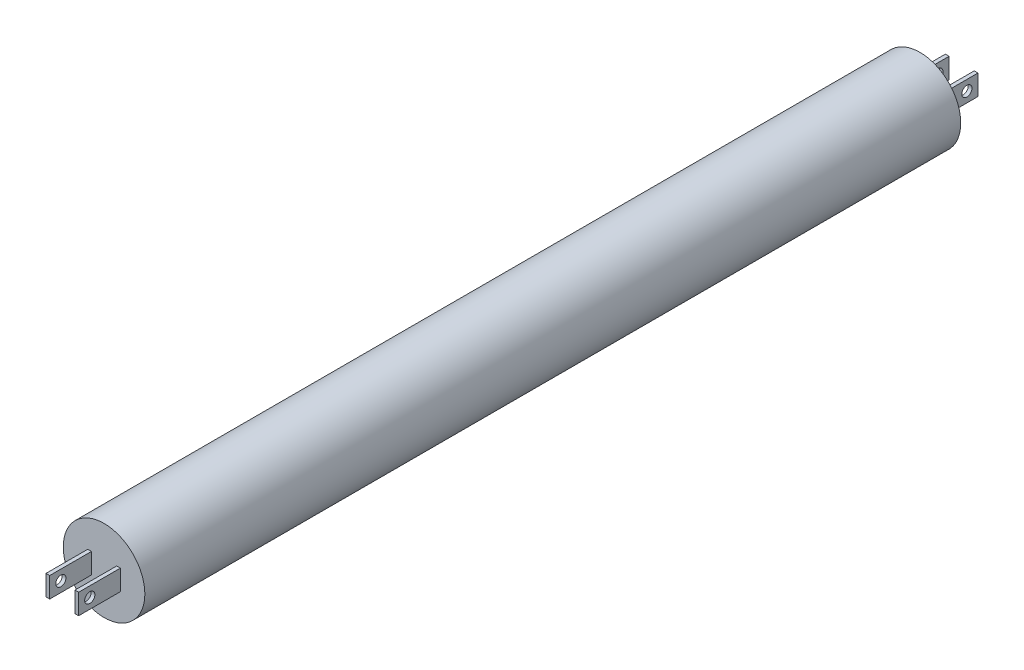
ISO-10303-21;
HEADER;
FILE_DESCRIPTION(('STEP AP214'),'2;1');
FILE_NAME('part.step','',(''),(''),'','','');
FILE_SCHEMA(('AUTOMOTIVE_DESIGN { 1 0 10303 214 1 1 1 1 }'));
ENDSEC;
DATA;
#1=APPLICATION_CONTEXT('core data for automotive mechanical design processes');
#2=APPLICATION_PROTOCOL_DEFINITION('international standard','automotive_design',2000,#1);
#3=PRODUCT_CONTEXT('',#1,'mechanical');
#4=PRODUCT('Part','Part','',(#3));
#5=PRODUCT_RELATED_PRODUCT_CATEGORY('part','',(#4));
#6=PRODUCT_DEFINITION_FORMATION('','',#4);
#7=PRODUCT_DEFINITION_CONTEXT('part definition',#1,'design');
#8=PRODUCT_DEFINITION('design','',#6,#7);
#9=PRODUCT_DEFINITION_SHAPE('','',#8);
#10=(LENGTH_UNIT() NAMED_UNIT(*) SI_UNIT(.MILLI.,.METRE.));
#11=(NAMED_UNIT(*) PLANE_ANGLE_UNIT() SI_UNIT($,.RADIAN.));
#12=(NAMED_UNIT(*) SI_UNIT($,.STERADIAN.) SOLID_ANGLE_UNIT());
#13=UNCERTAINTY_MEASURE_WITH_UNIT(LENGTH_MEASURE(1.E-05),#10,'distance_accuracy_value','');
#14=(GEOMETRIC_REPRESENTATION_CONTEXT(3) GLOBAL_UNCERTAINTY_ASSIGNED_CONTEXT((#13)) GLOBAL_UNIT_ASSIGNED_CONTEXT((#10,
#11,#12)) REPRESENTATION_CONTEXT('',''));
#15=CARTESIAN_POINT('',(0.,0.,0.));
#16=DIRECTION('',(0.,0.,1.));
#17=DIRECTION('',(1.,0.,0.));
#18=AXIS2_PLACEMENT_3D('',#15,#16,#17);
#19=CARTESIAN_POINT('',(0.,0.,200.));
#20=DIRECTION('',(0.,0.,-1.));
#21=DIRECTION('',(-1.,0.,0.));
#22=AXIS2_PLACEMENT_3D('',#19,#20,#21);
#23=CYLINDRICAL_SURFACE('',#22,20.);
#24=CARTESIAN_POINT('',(0.,0.,200.));
#25=DIRECTION('',(0.,0.,1.));
#26=DIRECTION('',(1.,0.,0.));
#27=AXIS2_PLACEMENT_3D('',#24,#25,#26);
#28=CIRCLE('',#27,20.);
#29=CARTESIAN_POINT('',(20.,0.,200.));
#30=VERTEX_POINT('',#29);
#31=EDGE_CURVE('E11',#30,#30,#28,.T.);
#32=ORIENTED_EDGE('',*,*,#31,.F.);
#33=EDGE_LOOP('',(#32));
#34=FACE_BOUND('',#33,.T.);
#35=CARTESIAN_POINT('',(0.,0.,-200.));
#36=DIRECTION('',(0.,0.,1.));
#37=DIRECTION('',(1.,0.,0.));
#38=AXIS2_PLACEMENT_3D('',#35,#36,#37);
#39=CIRCLE('',#38,20.);
#40=CARTESIAN_POINT('',(20.,0.,-200.));
#41=VERTEX_POINT('',#40);
#42=EDGE_CURVE('E43',#41,#41,#39,.T.);
#43=ORIENTED_EDGE('',*,*,#42,.T.);
#44=EDGE_LOOP('',(#43));
#45=FACE_BOUND('',#44,.T.);
#46=ADVANCED_FACE('F35',(#34,#45),#23,.T.);
#47=CARTESIAN_POINT('',(0.,0.,200.));
#48=DIRECTION('',(0.,0.,1.));
#49=DIRECTION('',(1.,0.,0.));
#50=AXIS2_PLACEMENT_3D('',#47,#48,#49);
#51=PLANE('',#50);
#52=DIRECTION('',(-1.,0.,0.));
#53=VECTOR('',#52,1.);
#54=CARTESIAN_POINT('',(0.,5.,200.));
#55=LINE('',#54,#53);
#56=CARTESIAN_POINT('',(-6.18051130788882,5.,200.));
#57=VERTEX_POINT('',#56);
#58=CARTESIAN_POINT('',(-8.,5.,200.));
#59=VERTEX_POINT('',#58);
#60=EDGE_CURVE('E218',#57,#59,#55,.T.);
#61=ORIENTED_EDGE('',*,*,#60,.F.);
#62=DIRECTION('',(0.,-1.,0.));
#63=VECTOR('',#62,1.);
#64=CARTESIAN_POINT('',(-6.18051130788882,5.,200.));
#65=LINE('',#64,#63);
#66=CARTESIAN_POINT('',(-6.18051130788882,-5.,200.));
#67=VERTEX_POINT('',#66);
#68=EDGE_CURVE('E230',#57,#67,#65,.T.);
#69=ORIENTED_EDGE('',*,*,#68,.T.);
#70=DIRECTION('',(-1.,0.,0.));
#71=VECTOR('',#70,1.);
#72=CARTESIAN_POINT('',(0.,-5.,200.));
#73=LINE('',#72,#71);
#74=CARTESIAN_POINT('',(-8.,-5.,200.));
#75=VERTEX_POINT('',#74);
#76=EDGE_CURVE('E217',#67,#75,#73,.T.);
#77=ORIENTED_EDGE('',*,*,#76,.T.);
#78=DIRECTION('',(0.,-1.,0.));
#79=VECTOR('',#78,1.);
#80=CARTESIAN_POINT('',(-8.,5.,200.));
#81=LINE('',#80,#79);
#82=EDGE_CURVE('E247',#59,#75,#81,.T.);
#83=ORIENTED_EDGE('',*,*,#82,.F.);
#84=EDGE_LOOP('',(#61,#69,#77,#83));
#85=FACE_BOUND('',#84,.T.);
#86=DIRECTION('',(1.,0.,0.));
#87=VECTOR('',#86,1.);
#88=CARTESIAN_POINT('',(0.,5.,200.));
#89=LINE('',#88,#87);
#90=CARTESIAN_POINT('',(6.18051130788882,5.,200.));
#91=VERTEX_POINT('',#90);
#92=CARTESIAN_POINT('',(8.,5.,200.));
#93=VERTEX_POINT('',#92);
#94=EDGE_CURVE('E250',#91,#93,#89,.T.);
#95=ORIENTED_EDGE('',*,*,#94,.T.);
#96=DIRECTION('',(0.,-1.,0.));
#97=VECTOR('',#96,1.);
#98=CARTESIAN_POINT('',(8.,5.,200.));
#99=LINE('',#98,#97);
#100=CARTESIAN_POINT('',(8.,-5.,200.));
#101=VERTEX_POINT('',#100);
#102=EDGE_CURVE('E261',#93,#101,#99,.T.);
#103=ORIENTED_EDGE('',*,*,#102,.T.);
#104=DIRECTION('',(1.,0.,0.));
#105=VECTOR('',#104,1.);
#106=CARTESIAN_POINT('',(0.,-5.,200.));
#107=LINE('',#106,#105);
#108=CARTESIAN_POINT('',(6.18051130788881,-5.,200.));
#109=VERTEX_POINT('',#108);
#110=EDGE_CURVE('E249',#109,#101,#107,.T.);
#111=ORIENTED_EDGE('',*,*,#110,.F.);
#112=DIRECTION('',(0.,-1.,0.));
#113=VECTOR('',#112,1.);
#114=CARTESIAN_POINT('',(6.18051130788882,5.,200.));
#115=LINE('',#114,#113);
#116=EDGE_CURVE('E277',#91,#109,#115,.T.);
#117=ORIENTED_EDGE('',*,*,#116,.F.);
#118=EDGE_LOOP('',(#95,#103,#111,#117));
#119=FACE_BOUND('',#118,.T.);
#120=ORIENTED_EDGE('',*,*,#31,.T.);
#121=EDGE_LOOP('',(#120));
#122=FACE_BOUND('',#121,.T.);
#123=ADVANCED_FACE('F321',(#85,#119,#122),#51,.T.);
#124=CARTESIAN_POINT('',(0.,0.,-200.));
#125=DIRECTION('',(0.,0.,1.));
#126=DIRECTION('',(1.,0.,0.));
#127=AXIS2_PLACEMENT_3D('',#124,#125,#126);
#128=PLANE('',#127);
#129=DIRECTION('',(0.,-1.,0.));
#130=VECTOR('',#129,1.);
#131=CARTESIAN_POINT('',(-6.18051130788881,5.,-200.));
#132=LINE('',#131,#130);
#133=CARTESIAN_POINT('',(-6.18051130788881,5.,-200.));
#134=VERTEX_POINT('',#133);
#135=CARTESIAN_POINT('',(-6.18051130788881,-5.,-200.));
#136=VERTEX_POINT('',#135);
#137=EDGE_CURVE('E51',#134,#136,#132,.T.);
#138=ORIENTED_EDGE('',*,*,#137,.F.);
#139=DIRECTION('',(-1.,0.,0.));
#140=VECTOR('',#139,1.);
#141=CARTESIAN_POINT('',(0.,5.,-200.));
#142=LINE('',#141,#140);
#143=CARTESIAN_POINT('',(-7.99999999999999,5.,-200.));
#144=VERTEX_POINT('',#143);
#145=EDGE_CURVE('E56',#134,#144,#142,.T.);
#146=ORIENTED_EDGE('',*,*,#145,.T.);
#147=DIRECTION('',(0.,-1.,0.));
#148=VECTOR('',#147,1.);
#149=CARTESIAN_POINT('',(-7.99999999999999,5.,-200.));
#150=LINE('',#149,#148);
#151=CARTESIAN_POINT('',(-7.99999999999999,-5.,-200.));
#152=VERTEX_POINT('',#151);
#153=EDGE_CURVE('E169',#144,#152,#150,.T.);
#154=ORIENTED_EDGE('',*,*,#153,.T.);
#155=DIRECTION('',(-1.,0.,0.));
#156=VECTOR('',#155,1.);
#157=CARTESIAN_POINT('',(0.,-5.,-200.));
#158=LINE('',#157,#156);
#159=EDGE_CURVE('E173',#136,#152,#158,.T.);
#160=ORIENTED_EDGE('',*,*,#159,.F.);
#161=EDGE_LOOP('',(#138,#146,#154,#160));
#162=FACE_BOUND('',#161,.T.);
#163=DIRECTION('',(0.,-1.,0.));
#164=VECTOR('',#163,1.);
#165=CARTESIAN_POINT('',(7.99999999999999,5.,-200.));
#166=LINE('',#165,#164);
#167=CARTESIAN_POINT('',(7.99999999999999,5.,-200.));
#168=VERTEX_POINT('',#167);
#169=CARTESIAN_POINT('',(8.,-5.,-200.));
#170=VERTEX_POINT('',#169);
#171=EDGE_CURVE('E210',#168,#170,#166,.T.);
#172=ORIENTED_EDGE('',*,*,#171,.F.);
#173=DIRECTION('',(1.,0.,0.));
#174=VECTOR('',#173,1.);
#175=CARTESIAN_POINT('',(0.,5.,-200.));
#176=LINE('',#175,#174);
#177=CARTESIAN_POINT('',(6.18051130788881,5.,-200.));
#178=VERTEX_POINT('',#177);
#179=EDGE_CURVE('E194',#178,#168,#176,.T.);
#180=ORIENTED_EDGE('',*,*,#179,.F.);
#181=DIRECTION('',(0.,-1.,0.));
#182=VECTOR('',#181,1.);
#183=CARTESIAN_POINT('',(6.18051130788881,5.,-200.));
#184=LINE('',#183,#182);
#185=CARTESIAN_POINT('',(6.18051130788881,-5.,-200.));
#186=VERTEX_POINT('',#185);
#187=EDGE_CURVE('E213',#178,#186,#184,.T.);
#188=ORIENTED_EDGE('',*,*,#187,.T.);
#189=DIRECTION('',(1.,0.,0.));
#190=VECTOR('',#189,1.);
#191=CARTESIAN_POINT('',(0.,-5.,-200.));
#192=LINE('',#191,#190);
#193=EDGE_CURVE('E205',#186,#170,#192,.T.);
#194=ORIENTED_EDGE('',*,*,#193,.T.);
#195=EDGE_LOOP('',(#172,#180,#188,#194));
#196=FACE_BOUND('',#195,.T.);
#197=ORIENTED_EDGE('',*,*,#42,.F.);
#198=EDGE_LOOP('',(#197));
#199=FACE_BOUND('',#198,.T.);
#200=ADVANCED_FACE('F326',(#162,#196,#199),#128,.F.);
#201=CARTESIAN_POINT('',(6.18051130788887,5.,0.));
#202=DIRECTION('',(1.,0.,0.));
#203=DIRECTION('',(0.,0.,-1.));
#204=AXIS2_PLACEMENT_3D('',#201,#202,#203);
#205=PLANE('',#204);
#206=CARTESIAN_POINT('',(6.18051130788881,0.,215.));
#207=DIRECTION('',(1.,0.,0.));
#208=DIRECTION('',(0.,0.,-1.));
#209=AXIS2_PLACEMENT_3D('',#206,#207,#208);
#210=CIRCLE('',#209,2.5);
#211=CARTESIAN_POINT('',(6.18051130788882,0.,212.5));
#212=VERTEX_POINT('',#211);
#213=EDGE_CURVE('E176',#212,#212,#210,.T.);
#214=ORIENTED_EDGE('',*,*,#213,.T.);
#215=EDGE_LOOP('',(#214));
#216=FACE_BOUND('',#215,.T.);
#217=DIRECTION('',(0.,0.,1.));
#218=VECTOR('',#217,1.);
#219=CARTESIAN_POINT('',(6.18051130788887,-5.,0.));
#220=LINE('',#219,#218);
#221=CARTESIAN_POINT('',(6.18051130788881,-5.,220.46));
#222=VERTEX_POINT('',#221);
#223=EDGE_CURVE('E263',#109,#222,#220,.T.);
#224=ORIENTED_EDGE('',*,*,#223,.T.);
#225=DIRECTION('',(0.,-1.,0.));
#226=VECTOR('',#225,1.);
#227=CARTESIAN_POINT('',(6.18051130788881,5.,220.46));
#228=LINE('',#227,#226);
#229=CARTESIAN_POINT('',(6.18051130788881,5.,220.46));
#230=VERTEX_POINT('',#229);
#231=EDGE_CURVE('E274',#230,#222,#228,.T.);
#232=ORIENTED_EDGE('',*,*,#231,.F.);
#233=DIRECTION('',(0.,0.,1.));
#234=VECTOR('',#233,1.);
#235=CARTESIAN_POINT('',(6.18051130788887,5.,0.));
#236=LINE('',#235,#234);
#237=EDGE_CURVE('E253',#91,#230,#236,.T.);
#238=ORIENTED_EDGE('',*,*,#237,.F.);
#239=ORIENTED_EDGE('',*,*,#116,.T.);
#240=EDGE_LOOP('',(#224,#232,#238,#239));
#241=FACE_BOUND('',#240,.T.);
#242=ADVANCED_FACE('F306',(#216,#241),#205,.F.);
#243=CARTESIAN_POINT('',(0.,5.,220.46));
#244=DIRECTION('',(0.,0.,-1.));
#245=DIRECTION('',(-1.,0.,0.));
#246=AXIS2_PLACEMENT_3D('',#243,#244,#245);
#247=PLANE('',#246);
#248=DIRECTION('',(1.,0.,0.));
#249=VECTOR('',#248,1.);
#250=CARTESIAN_POINT('',(0.,-5.,220.46));
#251=LINE('',#250,#249);
#252=CARTESIAN_POINT('',(8.,-5.,220.46));
#253=VERTEX_POINT('',#252);
#254=EDGE_CURVE('E265',#222,#253,#251,.T.);
#255=ORIENTED_EDGE('',*,*,#254,.T.);
#256=DIRECTION('',(0.,-1.,0.));
#257=VECTOR('',#256,1.);
#258=CARTESIAN_POINT('',(8.,5.,220.46));
#259=LINE('',#258,#257);
#260=CARTESIAN_POINT('',(8.,5.,220.46));
#261=VERTEX_POINT('',#260);
#262=EDGE_CURVE('E272',#261,#253,#259,.T.);
#263=ORIENTED_EDGE('',*,*,#262,.F.);
#264=DIRECTION('',(1.,0.,0.));
#265=VECTOR('',#264,1.);
#266=CARTESIAN_POINT('',(0.,5.,220.46));
#267=LINE('',#266,#265);
#268=EDGE_CURVE('E256',#230,#261,#267,.T.);
#269=ORIENTED_EDGE('',*,*,#268,.F.);
#270=ORIENTED_EDGE('',*,*,#231,.T.);
#271=EDGE_LOOP('',(#255,#263,#269,#270));
#272=FACE_BOUND('',#271,.T.);
#273=ADVANCED_FACE('F337',(#272),#247,.F.);
#274=CARTESIAN_POINT('',(8.00000000000004,5.,0.));
#275=DIRECTION('',(1.,0.,0.));
#276=DIRECTION('',(0.,0.,-1.));
#277=AXIS2_PLACEMENT_3D('',#274,#275,#276);
#278=PLANE('',#277);
#279=CARTESIAN_POINT('',(8.,0.,215.));
#280=DIRECTION('',(1.,0.,0.));
#281=DIRECTION('',(0.,0.,-1.));
#282=AXIS2_PLACEMENT_3D('',#279,#280,#281);
#283=CIRCLE('',#282,2.5);
#284=CARTESIAN_POINT('',(8.,0.,212.5));
#285=VERTEX_POINT('',#284);
#286=EDGE_CURVE('E300',#285,#285,#283,.T.);
#287=ORIENTED_EDGE('',*,*,#286,.F.);
#288=EDGE_LOOP('',(#287));
#289=FACE_BOUND('',#288,.T.);
#290=DIRECTION('',(0.,0.,1.));
#291=VECTOR('',#290,1.);
#292=CARTESIAN_POINT('',(8.00000000000004,-5.,0.));
#293=LINE('',#292,#291);
#294=EDGE_CURVE('E254',#101,#253,#293,.T.);
#295=ORIENTED_EDGE('',*,*,#294,.F.);
#296=ORIENTED_EDGE('',*,*,#102,.F.);
#297=DIRECTION('',(0.,0.,1.));
#298=VECTOR('',#297,1.);
#299=CARTESIAN_POINT('',(8.00000000000004,5.,0.));
#300=LINE('',#299,#298);
#301=EDGE_CURVE('E258',#93,#261,#300,.T.);
#302=ORIENTED_EDGE('',*,*,#301,.T.);
#303=ORIENTED_EDGE('',*,*,#262,.T.);
#304=EDGE_LOOP('',(#295,#296,#302,#303));
#305=FACE_BOUND('',#304,.T.);
#306=ADVANCED_FACE('F343',(#289,#305),#278,.T.);
#307=CARTESIAN_POINT('',(0.,5.,0.));
#308=DIRECTION('',(0.,1.,0.));
#309=DIRECTION('',(0.,0.,1.));
#310=AXIS2_PLACEMENT_3D('',#307,#308,#309);
#311=PLANE('',#310);
#312=ORIENTED_EDGE('',*,*,#94,.F.);
#313=ORIENTED_EDGE('',*,*,#237,.T.);
#314=ORIENTED_EDGE('',*,*,#268,.T.);
#315=ORIENTED_EDGE('',*,*,#301,.F.);
#316=EDGE_LOOP('',(#312,#313,#314,#315));
#317=FACE_BOUND('',#316,.T.);
#318=ADVANCED_FACE('F347',(#317),#311,.T.);
#319=CARTESIAN_POINT('',(0.,-5.,0.));
#320=DIRECTION('',(0.,1.,0.));
#321=DIRECTION('',(0.,0.,1.));
#322=AXIS2_PLACEMENT_3D('',#319,#320,#321);
#323=PLANE('',#322);
#324=ORIENTED_EDGE('',*,*,#110,.T.);
#325=ORIENTED_EDGE('',*,*,#294,.T.);
#326=ORIENTED_EDGE('',*,*,#254,.F.);
#327=ORIENTED_EDGE('',*,*,#223,.F.);
#328=EDGE_LOOP('',(#324,#325,#326,#327));
#329=FACE_BOUND('',#328,.T.);
#330=ADVANCED_FACE('F349',(#329),#323,.F.);
#331=CARTESIAN_POINT('',(-8.00000000000004,5.,0.));
#332=DIRECTION('',(1.,0.,0.));
#333=DIRECTION('',(0.,0.,-1.));
#334=AXIS2_PLACEMENT_3D('',#331,#332,#333);
#335=PLANE('',#334);
#336=CARTESIAN_POINT('',(-8.,0.,215.));
#337=DIRECTION('',(1.,0.,0.));
#338=DIRECTION('',(0.,0.,-1.));
#339=AXIS2_PLACEMENT_3D('',#336,#337,#338);
#340=CIRCLE('',#339,2.5);
#341=CARTESIAN_POINT('',(-8.,0.,212.5));
#342=VERTEX_POINT('',#341);
#343=EDGE_CURVE('E297',#342,#342,#340,.T.);
#344=ORIENTED_EDGE('',*,*,#343,.T.);
#345=EDGE_LOOP('',(#344));
#346=FACE_BOUND('',#345,.T.);
#347=DIRECTION('',(0.,0.,1.));
#348=VECTOR('',#347,1.);
#349=CARTESIAN_POINT('',(-8.00000000000004,-5.,0.));
#350=LINE('',#349,#348);
#351=CARTESIAN_POINT('',(-8.,-5.,220.46));
#352=VERTEX_POINT('',#351);
#353=EDGE_CURVE('E233',#75,#352,#350,.T.);
#354=ORIENTED_EDGE('',*,*,#353,.T.);
#355=DIRECTION('',(0.,-1.,0.));
#356=VECTOR('',#355,1.);
#357=CARTESIAN_POINT('',(-8.,5.,220.46));
#358=LINE('',#357,#356);
#359=CARTESIAN_POINT('',(-8.,5.,220.46));
#360=VERTEX_POINT('',#359);
#361=EDGE_CURVE('E245',#360,#352,#358,.T.);
#362=ORIENTED_EDGE('',*,*,#361,.F.);
#363=DIRECTION('',(0.,0.,1.));
#364=VECTOR('',#363,1.);
#365=CARTESIAN_POINT('',(-8.00000000000004,5.,0.));
#366=LINE('',#365,#364);
#367=EDGE_CURVE('E221',#59,#360,#366,.T.);
#368=ORIENTED_EDGE('',*,*,#367,.F.);
#369=ORIENTED_EDGE('',*,*,#82,.T.);
#370=EDGE_LOOP('',(#354,#362,#368,#369));
#371=FACE_BOUND('',#370,.T.);
#372=ADVANCED_FACE('F352',(#346,#371),#335,.F.);
#373=CARTESIAN_POINT('',(0.,5.,220.46));
#374=DIRECTION('',(0.,0.,1.));
#375=DIRECTION('',(1.,0.,0.));
#376=AXIS2_PLACEMENT_3D('',#373,#374,#375);
#377=PLANE('',#376);
#378=DIRECTION('',(-1.,0.,0.));
#379=VECTOR('',#378,1.);
#380=CARTESIAN_POINT('',(0.,-5.,220.46));
#381=LINE('',#380,#379);
#382=CARTESIAN_POINT('',(-6.18051130788881,-5.,220.46));
#383=VERTEX_POINT('',#382);
#384=EDGE_CURVE('E236',#383,#352,#381,.T.);
#385=ORIENTED_EDGE('',*,*,#384,.F.);
#386=DIRECTION('',(0.,-1.,0.));
#387=VECTOR('',#386,1.);
#388=CARTESIAN_POINT('',(-6.18051130788881,5.,220.46));
#389=LINE('',#388,#387);
#390=CARTESIAN_POINT('',(-6.18051130788881,5.,220.46));
#391=VERTEX_POINT('',#390);
#392=EDGE_CURVE('E243',#391,#383,#389,.T.);
#393=ORIENTED_EDGE('',*,*,#392,.F.);
#394=DIRECTION('',(-1.,0.,0.));
#395=VECTOR('',#394,1.);
#396=CARTESIAN_POINT('',(0.,5.,220.46));
#397=LINE('',#396,#395);
#398=EDGE_CURVE('E224',#391,#360,#397,.T.);
#399=ORIENTED_EDGE('',*,*,#398,.T.);
#400=ORIENTED_EDGE('',*,*,#361,.T.);
#401=EDGE_LOOP('',(#385,#393,#399,#400));
#402=FACE_BOUND('',#401,.T.);
#403=ADVANCED_FACE('F359',(#402),#377,.T.);
#404=CARTESIAN_POINT('',(-6.18051130788887,5.,0.));
#405=DIRECTION('',(1.,0.,0.));
#406=DIRECTION('',(0.,0.,-1.));
#407=AXIS2_PLACEMENT_3D('',#404,#405,#406);
#408=PLANE('',#407);
#409=CARTESIAN_POINT('',(-6.18051130788881,0.,215.));
#410=DIRECTION('',(1.,0.,0.));
#411=DIRECTION('',(0.,0.,-1.));
#412=AXIS2_PLACEMENT_3D('',#409,#410,#411);
#413=CIRCLE('',#412,2.5);
#414=CARTESIAN_POINT('',(-6.18051130788882,0.,212.5));
#415=VERTEX_POINT('',#414);
#416=EDGE_CURVE('E38',#415,#415,#413,.T.);
#417=ORIENTED_EDGE('',*,*,#416,.F.);
#418=EDGE_LOOP('',(#417));
#419=FACE_BOUND('',#418,.T.);
#420=DIRECTION('',(0.,0.,1.));
#421=VECTOR('',#420,1.);
#422=CARTESIAN_POINT('',(-6.18051130788887,-5.,0.));
#423=LINE('',#422,#421);
#424=EDGE_CURVE('E222',#67,#383,#423,.T.);
#425=ORIENTED_EDGE('',*,*,#424,.F.);
#426=ORIENTED_EDGE('',*,*,#68,.F.);
#427=DIRECTION('',(0.,0.,1.));
#428=VECTOR('',#427,1.);
#429=CARTESIAN_POINT('',(-6.18051130788887,5.,0.));
#430=LINE('',#429,#428);
#431=EDGE_CURVE('E227',#57,#391,#430,.T.);
#432=ORIENTED_EDGE('',*,*,#431,.T.);
#433=ORIENTED_EDGE('',*,*,#392,.T.);
#434=EDGE_LOOP('',(#425,#426,#432,#433));
#435=FACE_BOUND('',#434,.T.);
#436=ADVANCED_FACE('F363',(#419,#435),#408,.T.);
#437=CARTESIAN_POINT('',(0.,5.,0.));
#438=DIRECTION('',(0.,1.,0.));
#439=DIRECTION('',(0.,0.,1.));
#440=AXIS2_PLACEMENT_3D('',#437,#438,#439);
#441=PLANE('',#440);
#442=ORIENTED_EDGE('',*,*,#60,.T.);
#443=ORIENTED_EDGE('',*,*,#367,.T.);
#444=ORIENTED_EDGE('',*,*,#398,.F.);
#445=ORIENTED_EDGE('',*,*,#431,.F.);
#446=EDGE_LOOP('',(#442,#443,#444,#445));
#447=FACE_BOUND('',#446,.T.);
#448=ADVANCED_FACE('F367',(#447),#441,.T.);
#449=CARTESIAN_POINT('',(0.,-5.,0.));
#450=DIRECTION('',(0.,1.,0.));
#451=DIRECTION('',(0.,0.,1.));
#452=AXIS2_PLACEMENT_3D('',#449,#450,#451);
#453=PLANE('',#452);
#454=ORIENTED_EDGE('',*,*,#76,.F.);
#455=ORIENTED_EDGE('',*,*,#424,.T.);
#456=ORIENTED_EDGE('',*,*,#384,.T.);
#457=ORIENTED_EDGE('',*,*,#353,.F.);
#458=EDGE_LOOP('',(#454,#455,#456,#457));
#459=FACE_BOUND('',#458,.T.);
#460=ADVANCED_FACE('F369',(#459),#453,.F.);
#461=CARTESIAN_POINT('',(0.,5.,-220.46));
#462=DIRECTION('',(0.,0.,-1.));
#463=DIRECTION('',(-1.,0.,0.));
#464=AXIS2_PLACEMENT_3D('',#461,#462,#463);
#465=PLANE('',#464);
#466=DIRECTION('',(1.,0.,0.));
#467=VECTOR('',#466,1.);
#468=CARTESIAN_POINT('',(0.,-5.,-220.46));
#469=LINE('',#468,#467);
#470=CARTESIAN_POINT('',(6.18051130788881,-5.,-220.46));
#471=VERTEX_POINT('',#470);
#472=CARTESIAN_POINT('',(8.,-5.,-220.46));
#473=VERTEX_POINT('',#472);
#474=EDGE_CURVE('E186',#471,#473,#469,.T.);
#475=ORIENTED_EDGE('',*,*,#474,.F.);
#476=DIRECTION('',(0.,-1.,0.));
#477=VECTOR('',#476,1.);
#478=CARTESIAN_POINT('',(6.18051130788881,5.,-220.46));
#479=LINE('',#478,#477);
#480=CARTESIAN_POINT('',(6.18051130788881,5.,-220.46));
#481=VERTEX_POINT('',#480);
#482=EDGE_CURVE('E215',#481,#471,#479,.T.);
#483=ORIENTED_EDGE('',*,*,#482,.F.);
#484=DIRECTION('',(1.,0.,0.));
#485=VECTOR('',#484,1.);
#486=CARTESIAN_POINT('',(0.,5.,-220.46));
#487=LINE('',#486,#485);
#488=CARTESIAN_POINT('',(8.,5.,-220.46));
#489=VERTEX_POINT('',#488);
#490=EDGE_CURVE('E187',#481,#489,#487,.T.);
#491=ORIENTED_EDGE('',*,*,#490,.T.);
#492=DIRECTION('',(0.,-1.,0.));
#493=VECTOR('',#492,1.);
#494=CARTESIAN_POINT('',(8.,5.,-220.46));
#495=LINE('',#494,#493);
#496=EDGE_CURVE('E199',#489,#473,#495,.T.);
#497=ORIENTED_EDGE('',*,*,#496,.T.);
#498=EDGE_LOOP('',(#475,#483,#491,#497));
#499=FACE_BOUND('',#498,.T.);
#500=ADVANCED_FACE('F372',(#499),#465,.T.);
#501=CARTESIAN_POINT('',(6.18051130788883,5.,0.));
#502=DIRECTION('',(-1.,0.,0.));
#503=DIRECTION('',(0.,0.,1.));
#504=AXIS2_PLACEMENT_3D('',#501,#502,#503);
#505=PLANE('',#504);
#506=CARTESIAN_POINT('',(6.18051130788881,0.,-215.));
#507=DIRECTION('',(-1.,0.,0.));
#508=DIRECTION('',(0.,0.,1.));
#509=AXIS2_PLACEMENT_3D('',#506,#507,#508);
#510=CIRCLE('',#509,2.5);
#511=CARTESIAN_POINT('',(6.18051130788881,0.,-212.5));
#512=VERTEX_POINT('',#511);
#513=EDGE_CURVE('E292',#512,#512,#510,.F.);
#514=ORIENTED_EDGE('',*,*,#513,.T.);
#515=EDGE_LOOP('',(#514));
#516=FACE_BOUND('',#515,.T.);
#517=DIRECTION('',(0.,0.,-1.));
#518=VECTOR('',#517,1.);
#519=CARTESIAN_POINT('',(6.18051130788883,-5.,0.));
#520=LINE('',#519,#518);
#521=EDGE_CURVE('E202',#186,#471,#520,.T.);
#522=ORIENTED_EDGE('',*,*,#521,.F.);
#523=ORIENTED_EDGE('',*,*,#187,.F.);
#524=DIRECTION('',(0.,0.,-1.));
#525=VECTOR('',#524,1.);
#526=CARTESIAN_POINT('',(6.18051130788883,5.,0.));
#527=LINE('',#526,#525);
#528=EDGE_CURVE('E190',#178,#481,#527,.T.);
#529=ORIENTED_EDGE('',*,*,#528,.T.);
#530=ORIENTED_EDGE('',*,*,#482,.T.);
#531=EDGE_LOOP('',(#522,#523,#529,#530));
#532=FACE_BOUND('',#531,.T.);
#533=ADVANCED_FACE('F379',(#516,#532),#505,.T.);
#534=CARTESIAN_POINT('',(7.99999999999996,5.,0.));
#535=DIRECTION('',(-1.,0.,0.));
#536=DIRECTION('',(0.,0.,1.));
#537=AXIS2_PLACEMENT_3D('',#534,#535,#536);
#538=PLANE('',#537);
#539=CARTESIAN_POINT('',(8.,0.,-215.));
#540=DIRECTION('',(-1.,0.,0.));
#541=DIRECTION('',(0.,0.,1.));
#542=AXIS2_PLACEMENT_3D('',#539,#540,#541);
#543=CIRCLE('',#542,2.5);
#544=CARTESIAN_POINT('',(8.,0.,-212.5));
#545=VERTEX_POINT('',#544);
#546=EDGE_CURVE('E287',#545,#545,#543,.F.);
#547=ORIENTED_EDGE('',*,*,#546,.F.);
#548=EDGE_LOOP('',(#547));
#549=FACE_BOUND('',#548,.T.);
#550=DIRECTION('',(0.,0.,-1.));
#551=VECTOR('',#550,1.);
#552=CARTESIAN_POINT('',(7.99999999999996,-5.,0.));
#553=LINE('',#552,#551);
#554=EDGE_CURVE('E191',#170,#473,#553,.T.);
#555=ORIENTED_EDGE('',*,*,#554,.T.);
#556=ORIENTED_EDGE('',*,*,#496,.F.);
#557=DIRECTION('',(0.,0.,-1.));
#558=VECTOR('',#557,1.);
#559=CARTESIAN_POINT('',(7.99999999999996,5.,0.));
#560=LINE('',#559,#558);
#561=EDGE_CURVE('E197',#168,#489,#560,.T.);
#562=ORIENTED_EDGE('',*,*,#561,.F.);
#563=ORIENTED_EDGE('',*,*,#171,.T.);
#564=EDGE_LOOP('',(#555,#556,#562,#563));
#565=FACE_BOUND('',#564,.T.);
#566=ADVANCED_FACE('F383',(#549,#565),#538,.F.);
#567=CARTESIAN_POINT('',(0.,5.,0.));
#568=DIRECTION('',(0.,1.,0.));
#569=DIRECTION('',(0.,0.,1.));
#570=AXIS2_PLACEMENT_3D('',#567,#568,#569);
#571=PLANE('',#570);
#572=ORIENTED_EDGE('',*,*,#490,.F.);
#573=ORIENTED_EDGE('',*,*,#528,.F.);
#574=ORIENTED_EDGE('',*,*,#179,.T.);
#575=ORIENTED_EDGE('',*,*,#561,.T.);
#576=EDGE_LOOP('',(#572,#573,#574,#575));
#577=FACE_BOUND('',#576,.T.);
#578=ADVANCED_FACE('F387',(#577),#571,.T.);
#579=CARTESIAN_POINT('',(0.,-5.,0.));
#580=DIRECTION('',(0.,1.,0.));
#581=DIRECTION('',(0.,0.,1.));
#582=AXIS2_PLACEMENT_3D('',#579,#580,#581);
#583=PLANE('',#582);
#584=ORIENTED_EDGE('',*,*,#474,.T.);
#585=ORIENTED_EDGE('',*,*,#554,.F.);
#586=ORIENTED_EDGE('',*,*,#193,.F.);
#587=ORIENTED_EDGE('',*,*,#521,.T.);
#588=EDGE_LOOP('',(#584,#585,#586,#587));
#589=FACE_BOUND('',#588,.T.);
#590=ADVANCED_FACE('F389',(#589),#583,.F.);
#591=CARTESIAN_POINT('',(-6.18051130788883,5.,0.));
#592=DIRECTION('',(-1.,0.,0.));
#593=DIRECTION('',(0.,0.,1.));
#594=AXIS2_PLACEMENT_3D('',#591,#592,#593);
#595=PLANE('',#594);
#596=CARTESIAN_POINT('',(-6.18051130788881,0.,-215.));
#597=DIRECTION('',(-1.,0.,0.));
#598=DIRECTION('',(0.,0.,1.));
#599=AXIS2_PLACEMENT_3D('',#596,#597,#598);
#600=CIRCLE('',#599,2.5);
#601=CARTESIAN_POINT('',(-6.18051130788881,0.,-212.5));
#602=VERTEX_POINT('',#601);
#603=EDGE_CURVE('E283',#602,#602,#600,.F.);
#604=ORIENTED_EDGE('',*,*,#603,.F.);
#605=EDGE_LOOP('',(#604));
#606=FACE_BOUND('',#605,.T.);
#607=DIRECTION('',(0.,0.,-1.));
#608=VECTOR('',#607,1.);
#609=CARTESIAN_POINT('',(-6.18051130788883,-5.,0.));
#610=LINE('',#609,#608);
#611=CARTESIAN_POINT('',(-6.18051130788881,-5.,-220.46));
#612=VERTEX_POINT('',#611);
#613=EDGE_CURVE('E159',#136,#612,#610,.T.);
#614=ORIENTED_EDGE('',*,*,#613,.T.);
#615=DIRECTION('',(0.,-1.,0.));
#616=VECTOR('',#615,1.);
#617=CARTESIAN_POINT('',(-6.18051130788881,5.,-220.46));
#618=LINE('',#617,#616);
#619=CARTESIAN_POINT('',(-6.18051130788881,5.,-220.46));
#620=VERTEX_POINT('',#619);
#621=EDGE_CURVE('E156',#620,#612,#618,.T.);
#622=ORIENTED_EDGE('',*,*,#621,.F.);
#623=DIRECTION('',(0.,0.,-1.));
#624=VECTOR('',#623,1.);
#625=CARTESIAN_POINT('',(-6.18051130788883,5.,0.));
#626=LINE('',#625,#624);
#627=EDGE_CURVE('E146',#134,#620,#626,.T.);
#628=ORIENTED_EDGE('',*,*,#627,.F.);
#629=ORIENTED_EDGE('',*,*,#137,.T.);
#630=EDGE_LOOP('',(#614,#622,#628,#629));
#631=FACE_BOUND('',#630,.T.);
#632=ADVANCED_FACE('F157',(#606,#631),#595,.F.);
#633=CARTESIAN_POINT('',(0.,5.,-220.46));
#634=DIRECTION('',(0.,0.,1.));
#635=DIRECTION('',(1.,0.,0.));
#636=AXIS2_PLACEMENT_3D('',#633,#634,#635);
#637=PLANE('',#636);
#638=DIRECTION('',(-1.,0.,0.));
#639=VECTOR('',#638,1.);
#640=CARTESIAN_POINT('',(0.,-5.,-220.46));
#641=LINE('',#640,#639);
#642=CARTESIAN_POINT('',(-8.,-5.,-220.46));
#643=VERTEX_POINT('',#642);
#644=EDGE_CURVE('E178',#612,#643,#641,.T.);
#645=ORIENTED_EDGE('',*,*,#644,.T.);
#646=DIRECTION('',(0.,-1.,0.));
#647=VECTOR('',#646,1.);
#648=CARTESIAN_POINT('',(-8.,5.,-220.46));
#649=LINE('',#648,#647);
#650=CARTESIAN_POINT('',(-8.,5.,-220.46));
#651=VERTEX_POINT('',#650);
#652=EDGE_CURVE('E163',#651,#643,#649,.T.);
#653=ORIENTED_EDGE('',*,*,#652,.F.);
#654=DIRECTION('',(-1.,0.,0.));
#655=VECTOR('',#654,1.);
#656=CARTESIAN_POINT('',(0.,5.,-220.46));
#657=LINE('',#656,#655);
#658=EDGE_CURVE('E151',#620,#651,#657,.T.);
#659=ORIENTED_EDGE('',*,*,#658,.F.);
#660=ORIENTED_EDGE('',*,*,#621,.T.);
#661=EDGE_LOOP('',(#645,#653,#659,#660));
#662=FACE_BOUND('',#661,.T.);
#663=ADVANCED_FACE('F165',(#662),#637,.F.);
#664=CARTESIAN_POINT('',(-7.99999999999996,5.,0.));
#665=DIRECTION('',(-1.,0.,0.));
#666=DIRECTION('',(0.,0.,1.));
#667=AXIS2_PLACEMENT_3D('',#664,#665,#666);
#668=PLANE('',#667);
#669=CARTESIAN_POINT('',(-7.99999999999999,0.,-215.));
#670=DIRECTION('',(-1.,0.,0.));
#671=DIRECTION('',(0.,0.,1.));
#672=AXIS2_PLACEMENT_3D('',#669,#670,#671);
#673=CIRCLE('',#672,2.5);
#674=CARTESIAN_POINT('',(-7.99999999999999,0.,-212.5));
#675=VERTEX_POINT('',#674);
#676=EDGE_CURVE('E281',#675,#675,#673,.F.);
#677=ORIENTED_EDGE('',*,*,#676,.T.);
#678=EDGE_LOOP('',(#677));
#679=FACE_BOUND('',#678,.T.);
#680=DIRECTION('',(0.,0.,-1.));
#681=VECTOR('',#680,1.);
#682=CARTESIAN_POINT('',(-7.99999999999996,-5.,0.));
#683=LINE('',#682,#681);
#684=EDGE_CURVE('E180',#152,#643,#683,.T.);
#685=ORIENTED_EDGE('',*,*,#684,.F.);
#686=ORIENTED_EDGE('',*,*,#153,.F.);
#687=DIRECTION('',(0.,0.,-1.));
#688=VECTOR('',#687,1.);
#689=CARTESIAN_POINT('',(-7.99999999999996,5.,0.));
#690=LINE('',#689,#688);
#691=EDGE_CURVE('E167',#144,#651,#690,.T.);
#692=ORIENTED_EDGE('',*,*,#691,.T.);
#693=ORIENTED_EDGE('',*,*,#652,.T.);
#694=EDGE_LOOP('',(#685,#686,#692,#693));
#695=FACE_BOUND('',#694,.T.);
#696=ADVANCED_FACE('F401',(#679,#695),#668,.T.);
#697=CARTESIAN_POINT('',(0.,5.,0.));
#698=DIRECTION('',(0.,1.,0.));
#699=DIRECTION('',(0.,0.,1.));
#700=AXIS2_PLACEMENT_3D('',#697,#698,#699);
#701=PLANE('',#700);
#702=ORIENTED_EDGE('',*,*,#145,.F.);
#703=ORIENTED_EDGE('',*,*,#627,.T.);
#704=ORIENTED_EDGE('',*,*,#658,.T.);
#705=ORIENTED_EDGE('',*,*,#691,.F.);
#706=EDGE_LOOP('',(#702,#703,#704,#705));
#707=FACE_BOUND('',#706,.T.);
#708=ADVANCED_FACE('F148',(#707),#701,.T.);
#709=CARTESIAN_POINT('',(0.,-5.,0.));
#710=DIRECTION('',(0.,1.,0.));
#711=DIRECTION('',(0.,0.,1.));
#712=AXIS2_PLACEMENT_3D('',#709,#710,#711);
#713=PLANE('',#712);
#714=ORIENTED_EDGE('',*,*,#159,.T.);
#715=ORIENTED_EDGE('',*,*,#684,.T.);
#716=ORIENTED_EDGE('',*,*,#644,.F.);
#717=ORIENTED_EDGE('',*,*,#613,.F.);
#718=EDGE_LOOP('',(#714,#715,#716,#717));
#719=FACE_BOUND('',#718,.T.);
#720=ADVANCED_FACE('F404',(#719),#713,.F.);
#721=CARTESIAN_POINT('',(-9.,0.,-215.));
#722=DIRECTION('',(1.,0.,0.));
#723=DIRECTION('',(0.,0.,-1.));
#724=AXIS2_PLACEMENT_3D('',#721,#722,#723);
#725=CYLINDRICAL_SURFACE('',#724,2.5);
#726=ORIENTED_EDGE('',*,*,#676,.F.);
#727=EDGE_LOOP('',(#726));
#728=FACE_BOUND('',#727,.T.);
#729=ORIENTED_EDGE('',*,*,#603,.T.);
#730=EDGE_LOOP('',(#729));
#731=FACE_BOUND('',#730,.T.);
#732=ADVANCED_FACE('F407',(#728,#731),#725,.F.);
#733=ORIENTED_EDGE('',*,*,#513,.F.);
#734=EDGE_LOOP('',(#733));
#735=FACE_BOUND('',#734,.T.);
#736=ORIENTED_EDGE('',*,*,#546,.T.);
#737=EDGE_LOOP('',(#736));
#738=FACE_BOUND('',#737,.T.);
#739=ADVANCED_FACE('F317',(#735,#738),#725,.F.);
#740=CARTESIAN_POINT('',(-9.,0.,215.));
#741=DIRECTION('',(1.,0.,0.));
#742=DIRECTION('',(0.,0.,-1.));
#743=AXIS2_PLACEMENT_3D('',#740,#741,#742);
#744=CYLINDRICAL_SURFACE('',#743,2.5);
#745=ORIENTED_EDGE('',*,*,#416,.T.);
#746=EDGE_LOOP('',(#745));
#747=FACE_BOUND('',#746,.T.);
#748=ORIENTED_EDGE('',*,*,#343,.F.);
#749=EDGE_LOOP('',(#748));
#750=FACE_BOUND('',#749,.T.);
#751=ADVANCED_FACE('F311',(#747,#750),#744,.F.);
#752=ORIENTED_EDGE('',*,*,#286,.T.);
#753=EDGE_LOOP('',(#752));
#754=FACE_BOUND('',#753,.T.);
#755=ORIENTED_EDGE('',*,*,#213,.F.);
#756=EDGE_LOOP('',(#755));
#757=FACE_BOUND('',#756,.T.);
#758=ADVANCED_FACE('F309',(#754,#757),#744,.F.);
#759=CLOSED_SHELL('',(#46,#123,#200,#242,#273,#306,#318,#330,#372,#403,#436,#448,#460,#500,#533,
#566,#578,#590,#632,#663,#696,#708,#720,#732,#739,#751,#758));
#760=MANIFOLD_SOLID_BREP('B2',#759);
#761=ADVANCED_BREP_SHAPE_REPRESENTATION('',(#18,#760),#14);
#762=SHAPE_DEFINITION_REPRESENTATION(#9,#761);
ENDSEC;
END-ISO-10303-21;
